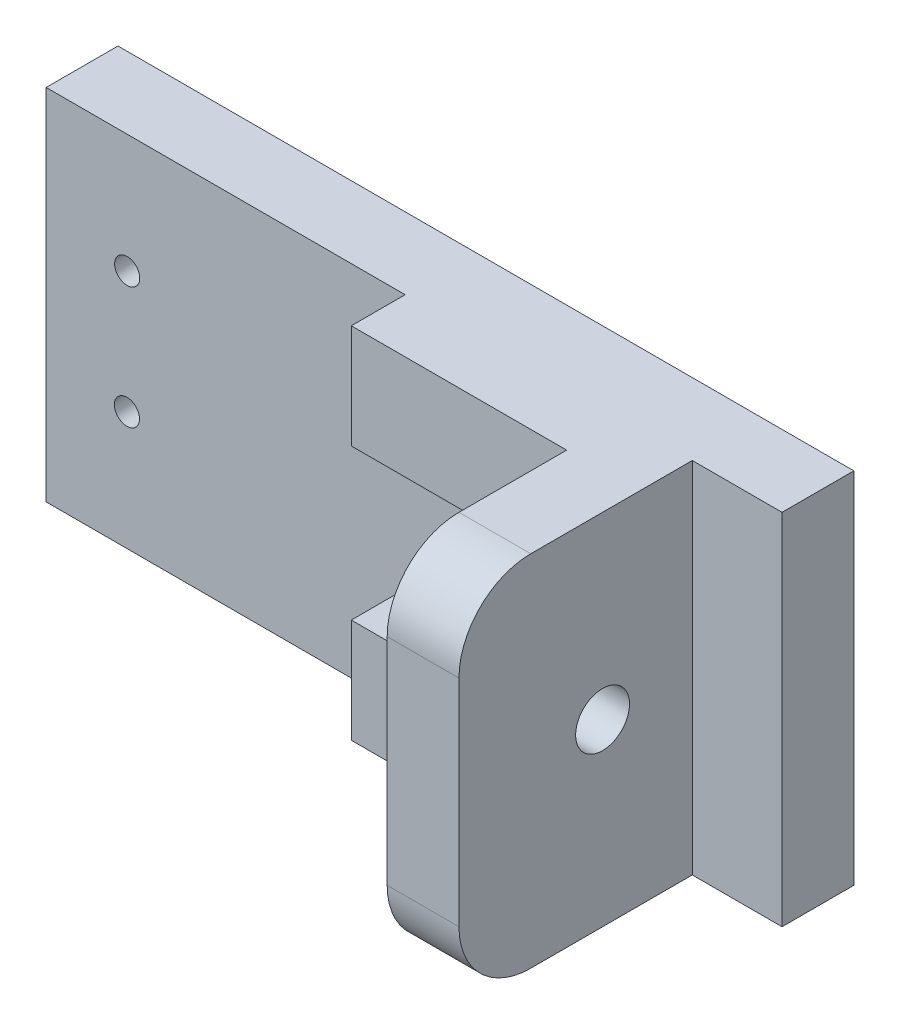
ISO-10303-21;
HEADER;
FILE_DESCRIPTION(('STEP AP214'),'2;1');
FILE_NAME('part.step','',(''),(''),'','','');
FILE_SCHEMA(('AUTOMOTIVE_DESIGN { 1 0 10303 214 1 1 1 1 }'));
ENDSEC;
DATA;
#1=APPLICATION_CONTEXT('core data for automotive mechanical design processes');
#2=APPLICATION_PROTOCOL_DEFINITION('international standard','automotive_design',2000,#1);
#3=PRODUCT_CONTEXT('',#1,'mechanical');
#4=PRODUCT('Part','Part','',(#3));
#5=PRODUCT_RELATED_PRODUCT_CATEGORY('part','',(#4));
#6=PRODUCT_DEFINITION_FORMATION('','',#4);
#7=PRODUCT_DEFINITION_CONTEXT('part definition',#1,'design');
#8=PRODUCT_DEFINITION('design','',#6,#7);
#9=PRODUCT_DEFINITION_SHAPE('','',#8);
#10=(LENGTH_UNIT() NAMED_UNIT(*) SI_UNIT(.MILLI.,.METRE.));
#11=(NAMED_UNIT(*) PLANE_ANGLE_UNIT() SI_UNIT($,.RADIAN.));
#12=(NAMED_UNIT(*) SI_UNIT($,.STERADIAN.) SOLID_ANGLE_UNIT());
#13=UNCERTAINTY_MEASURE_WITH_UNIT(LENGTH_MEASURE(1.E-05),#10,'distance_accuracy_value','');
#14=(GEOMETRIC_REPRESENTATION_CONTEXT(3) GLOBAL_UNCERTAINTY_ASSIGNED_CONTEXT((#13)) GLOBAL_UNIT_ASSIGNED_CONTEXT((#10,
#11,#12)) REPRESENTATION_CONTEXT('',''));
#15=CARTESIAN_POINT('',(0.,0.,0.));
#16=DIRECTION('',(0.,0.,1.));
#17=DIRECTION('',(1.,0.,0.));
#18=AXIS2_PLACEMENT_3D('',#15,#16,#17);
#19=CARTESIAN_POINT('',(0.,0.,20.));
#20=DIRECTION('',(0.,0.,-1.));
#21=DIRECTION('',(-1.,0.,0.));
#22=AXIS2_PLACEMENT_3D('',#19,#20,#21);
#23=PLANE('',#22);
#24=CARTESIAN_POINT('',(-80.,-17.,20.));
#25=DIRECTION('',(0.,0.,-1.));
#26=DIRECTION('',(-1.,0.,0.));
#27=AXIS2_PLACEMENT_3D('',#24,#25,#26);
#28=CIRCLE('',#27,3.49999999999999);
#29=CARTESIAN_POINT('',(-83.5,-17.,20.));
#30=VERTEX_POINT('',#29);
#31=EDGE_CURVE('E191',#30,#30,#28,.T.);
#32=ORIENTED_EDGE('',*,*,#31,.T.);
#33=EDGE_LOOP('',(#32));
#34=FACE_BOUND('',#33,.T.);
#35=CARTESIAN_POINT('',(-79.9316831395729,16.9999313647334,20.));
#36=DIRECTION('',(0.,0.,-1.));
#37=DIRECTION('',(-1.,0.,0.));
#38=AXIS2_PLACEMENT_3D('',#35,#36,#37);
#39=CIRCLE('',#38,3.49999999999999);
#40=CARTESIAN_POINT('',(-83.4316831395729,16.9999313647334,20.));
#41=VERTEX_POINT('',#40);
#42=EDGE_CURVE('E294',#41,#41,#39,.T.);
#43=ORIENTED_EDGE('',*,*,#42,.T.);
#44=EDGE_LOOP('',(#43));
#45=FACE_BOUND('',#44,.T.);
#46=DIRECTION('',(0.,-1.,0.));
#47=VECTOR('',#46,1.);
#48=CARTESIAN_POINT('',(57.5,-50.,20.));
#49=LINE('',#48,#47);
#50=CARTESIAN_POINT('',(57.5,21.,20.));
#51=VERTEX_POINT('',#50);
#52=CARTESIAN_POINT('',(57.5,-21.,20.));
#53=VERTEX_POINT('',#52);
#54=EDGE_CURVE('E175',#51,#53,#49,.T.);
#55=ORIENTED_EDGE('',*,*,#54,.F.);
#56=DIRECTION('',(1.,0.,0.));
#57=VECTOR('',#56,1.);
#58=CARTESIAN_POINT('',(57.5,21.,20.));
#59=LINE('',#58,#57);
#60=CARTESIAN_POINT('',(-2.50000000000002,21.,20.));
#61=VERTEX_POINT('',#60);
#62=EDGE_CURVE('E247',#61,#51,#59,.T.);
#63=ORIENTED_EDGE('',*,*,#62,.F.);
#64=DIRECTION('',(0.,-1.,0.));
#65=VECTOR('',#64,1.);
#66=CARTESIAN_POINT('',(-2.50000000000002,50.,20.));
#67=LINE('',#66,#65);
#68=CARTESIAN_POINT('',(-2.50000000000002,50.,20.));
#69=VERTEX_POINT('',#68);
#70=EDGE_CURVE('E244',#69,#61,#67,.T.);
#71=ORIENTED_EDGE('',*,*,#70,.F.);
#72=DIRECTION('',(-1.,0.,0.));
#73=VECTOR('',#72,1.);
#74=CARTESIAN_POINT('',(-102.5,50.,20.));
#75=LINE('',#74,#73);
#76=CARTESIAN_POINT('',(-102.5,50.,20.));
#77=VERTEX_POINT('',#76);
#78=EDGE_CURVE('E302',#69,#77,#75,.T.);
#79=ORIENTED_EDGE('',*,*,#78,.T.);
#80=DIRECTION('',(0.,-1.,0.));
#81=VECTOR('',#80,1.);
#82=CARTESIAN_POINT('',(-102.5,-50.,20.));
#83=LINE('',#82,#81);
#84=CARTESIAN_POINT('',(-102.5,-50.,20.));
#85=VERTEX_POINT('',#84);
#86=EDGE_CURVE('E182',#77,#85,#83,.T.);
#87=ORIENTED_EDGE('',*,*,#86,.T.);
#88=DIRECTION('',(1.,0.,0.));
#89=VECTOR('',#88,1.);
#90=CARTESIAN_POINT('',(-102.5,-50.,20.));
#91=LINE('',#90,#89);
#92=CARTESIAN_POINT('',(-2.50000000000004,-50.,20.));
#93=VERTEX_POINT('',#92);
#94=EDGE_CURVE('E181',#85,#93,#91,.T.);
#95=ORIENTED_EDGE('',*,*,#94,.T.);
#96=DIRECTION('',(0.,-1.,0.));
#97=VECTOR('',#96,1.);
#98=CARTESIAN_POINT('',(-2.50000000000002,-50.,20.));
#99=LINE('',#98,#97);
#100=CARTESIAN_POINT('',(-2.50000000000002,-21.,20.));
#101=VERTEX_POINT('',#100);
#102=EDGE_CURVE('E271',#101,#93,#99,.T.);
#103=ORIENTED_EDGE('',*,*,#102,.F.);
#104=DIRECTION('',(-1.,0.,0.));
#105=VECTOR('',#104,1.);
#106=CARTESIAN_POINT('',(57.5,-21.,20.));
#107=LINE('',#106,#105);
#108=EDGE_CURVE('E266',#53,#101,#107,.T.);
#109=ORIENTED_EDGE('',*,*,#108,.F.);
#110=EDGE_LOOP('',(#55,#63,#71,#79,#87,#95,#103,#109));
#111=FACE_BOUND('',#110,.T.);
#112=ADVANCED_FACE('F46',(#34,#45,#111),#23,.F.);
#113=DIRECTION('',(0.,1.,0.));
#114=VECTOR('',#113,1.);
#115=CARTESIAN_POINT('',(77.5,-50.,20.));
#116=LINE('',#115,#114);
#117=CARTESIAN_POINT('',(77.5,-50.,20.));
#118=VERTEX_POINT('',#117);
#119=CARTESIAN_POINT('',(77.5,50.,20.));
#120=VERTEX_POINT('',#119);
#121=EDGE_CURVE('E160',#118,#120,#116,.T.);
#122=ORIENTED_EDGE('',*,*,#121,.F.);
#123=CARTESIAN_POINT('',(102.5,-50.,20.));
#124=VERTEX_POINT('',#123);
#125=EDGE_CURVE('E171',#118,#124,#91,.T.);
#126=ORIENTED_EDGE('',*,*,#125,.T.);
#127=DIRECTION('',(0.,1.,0.));
#128=VECTOR('',#127,1.);
#129=CARTESIAN_POINT('',(102.5,-50.,20.));
#130=LINE('',#129,#128);
#131=CARTESIAN_POINT('',(102.5,50.,20.));
#132=VERTEX_POINT('',#131);
#133=EDGE_CURVE('E197',#124,#132,#130,.T.);
#134=ORIENTED_EDGE('',*,*,#133,.T.);
#135=EDGE_CURVE('E173',#132,#120,#75,.T.);
#136=ORIENTED_EDGE('',*,*,#135,.T.);
#137=EDGE_LOOP('',(#122,#126,#134,#136));
#138=FACE_BOUND('',#137,.T.);
#139=ADVANCED_FACE('F169',(#138),#23,.F.);
#140=CARTESIAN_POINT('',(102.5,-50.,20.));
#141=DIRECTION('',(-1.,0.,0.));
#142=DIRECTION('',(0.,0.,1.));
#143=AXIS2_PLACEMENT_3D('',#140,#141,#142);
#144=PLANE('',#143);
#145=DIRECTION('',(0.,1.,0.));
#146=VECTOR('',#145,1.);
#147=CARTESIAN_POINT('',(102.5,-50.,0.));
#148=LINE('',#147,#146);
#149=CARTESIAN_POINT('',(102.5,-50.,0.));
#150=VERTEX_POINT('',#149);
#151=CARTESIAN_POINT('',(102.5,50.,0.));
#152=VERTEX_POINT('',#151);
#153=EDGE_CURVE('E187',#150,#152,#148,.T.);
#154=ORIENTED_EDGE('',*,*,#153,.T.);
#155=DIRECTION('',(0.,0.,-1.));
#156=VECTOR('',#155,1.);
#157=CARTESIAN_POINT('',(102.5,50.,20.));
#158=LINE('',#157,#156);
#159=EDGE_CURVE('E205',#132,#152,#158,.T.);
#160=ORIENTED_EDGE('',*,*,#159,.F.);
#161=ORIENTED_EDGE('',*,*,#133,.F.);
#162=DIRECTION('',(0.,0.,-1.));
#163=VECTOR('',#162,1.);
#164=CARTESIAN_POINT('',(102.5,-50.,20.));
#165=LINE('',#164,#163);
#166=EDGE_CURVE('E179',#124,#150,#165,.T.);
#167=ORIENTED_EDGE('',*,*,#166,.T.);
#168=EDGE_LOOP('',(#154,#160,#161,#167));
#169=FACE_BOUND('',#168,.T.);
#170=ADVANCED_FACE('F350',(#169),#144,.F.);
#171=CARTESIAN_POINT('',(-102.5,50.,20.));
#172=DIRECTION('',(0.,-1.,0.));
#173=DIRECTION('',(0.,0.,-1.));
#174=AXIS2_PLACEMENT_3D('',#171,#172,#173);
#175=PLANE('',#174);
#176=DIRECTION('',(0.,0.,-1.));
#177=VECTOR('',#176,1.);
#178=CARTESIAN_POINT('',(57.5,50.,85.));
#179=LINE('',#178,#177);
#180=CARTESIAN_POINT('',(57.5,50.,65.));
#181=VERTEX_POINT('',#180);
#182=CARTESIAN_POINT('',(57.5,50.,35.));
#183=VERTEX_POINT('',#182);
#184=EDGE_CURVE('E229',#181,#183,#179,.T.);
#185=ORIENTED_EDGE('',*,*,#184,.F.);
#186=DIRECTION('',(-1.,0.,0.));
#187=VECTOR('',#186,1.);
#188=CARTESIAN_POINT('',(-102.5,50.,65.));
#189=LINE('',#188,#187);
#190=CARTESIAN_POINT('',(77.5,50.,65.));
#191=VERTEX_POINT('',#190);
#192=EDGE_CURVE('E69',#181,#191,#189,.F.);
#193=ORIENTED_EDGE('',*,*,#192,.T.);
#194=DIRECTION('',(0.,0.,-1.));
#195=VECTOR('',#194,1.);
#196=CARTESIAN_POINT('',(77.5,50.,85.));
#197=LINE('',#196,#195);
#198=EDGE_CURVE('E166',#191,#120,#197,.T.);
#199=ORIENTED_EDGE('',*,*,#198,.T.);
#200=ORIENTED_EDGE('',*,*,#135,.F.);
#201=ORIENTED_EDGE('',*,*,#159,.T.);
#202=DIRECTION('',(-1.,0.,0.));
#203=VECTOR('',#202,1.);
#204=CARTESIAN_POINT('',(-102.5,50.,0.));
#205=LINE('',#204,#203);
#206=CARTESIAN_POINT('',(-102.5,50.,0.));
#207=VERTEX_POINT('',#206);
#208=EDGE_CURVE('E190',#152,#207,#205,.T.);
#209=ORIENTED_EDGE('',*,*,#208,.T.);
#210=DIRECTION('',(0.,0.,-1.));
#211=VECTOR('',#210,1.);
#212=CARTESIAN_POINT('',(-102.5,50.,20.));
#213=LINE('',#212,#211);
#214=EDGE_CURVE('E202',#77,#207,#213,.T.);
#215=ORIENTED_EDGE('',*,*,#214,.F.);
#216=ORIENTED_EDGE('',*,*,#78,.F.);
#217=DIRECTION('',(0.,0.,-1.));
#218=VECTOR('',#217,1.);
#219=CARTESIAN_POINT('',(-2.50000000000002,50.,35.));
#220=LINE('',#219,#218);
#221=CARTESIAN_POINT('',(-2.50000000000002,50.,35.));
#222=VERTEX_POINT('',#221);
#223=EDGE_CURVE('E263',#222,#69,#220,.T.);
#224=ORIENTED_EDGE('',*,*,#223,.F.);
#225=DIRECTION('',(-1.,0.,0.));
#226=VECTOR('',#225,1.);
#227=CARTESIAN_POINT('',(57.5,50.,35.));
#228=LINE('',#227,#226);
#229=EDGE_CURVE('E237',#183,#222,#228,.T.);
#230=ORIENTED_EDGE('',*,*,#229,.F.);
#231=EDGE_LOOP('',(#185,#193,#199,#200,#201,#209,#215,#216,#224,#230));
#232=FACE_BOUND('',#231,.T.);
#233=ADVANCED_FACE('F235',(#232),#175,.F.);
#234=CARTESIAN_POINT('',(-102.5,-50.,20.));
#235=DIRECTION('',(1.,0.,0.));
#236=DIRECTION('',(0.,0.,-1.));
#237=AXIS2_PLACEMENT_3D('',#234,#235,#236);
#238=PLANE('',#237);
#239=DIRECTION('',(0.,-1.,0.));
#240=VECTOR('',#239,1.);
#241=CARTESIAN_POINT('',(-102.5,-50.,0.));
#242=LINE('',#241,#240);
#243=CARTESIAN_POINT('',(-102.5,-50.,0.));
#244=VERTEX_POINT('',#243);
#245=EDGE_CURVE('E193',#207,#244,#242,.T.);
#246=ORIENTED_EDGE('',*,*,#245,.T.);
#247=DIRECTION('',(0.,0.,-1.));
#248=VECTOR('',#247,1.);
#249=CARTESIAN_POINT('',(-102.5,-50.,20.));
#250=LINE('',#249,#248);
#251=EDGE_CURVE('E199',#85,#244,#250,.T.);
#252=ORIENTED_EDGE('',*,*,#251,.F.);
#253=ORIENTED_EDGE('',*,*,#86,.F.);
#254=ORIENTED_EDGE('',*,*,#214,.T.);
#255=EDGE_LOOP('',(#246,#252,#253,#254));
#256=FACE_BOUND('',#255,.T.);
#257=ADVANCED_FACE('F311',(#256),#238,.F.);
#258=CARTESIAN_POINT('',(-102.5,-50.,20.));
#259=DIRECTION('',(0.,1.,0.));
#260=DIRECTION('',(0.,0.,1.));
#261=AXIS2_PLACEMENT_3D('',#258,#259,#260);
#262=PLANE('',#261);
#263=DIRECTION('',(0.,0.,-1.));
#264=VECTOR('',#263,1.);
#265=CARTESIAN_POINT('',(77.5,-50.,85.));
#266=LINE('',#265,#264);
#267=CARTESIAN_POINT('',(77.5,-50.,65.));
#268=VERTEX_POINT('',#267);
#269=EDGE_CURVE('E157',#268,#118,#266,.T.);
#270=ORIENTED_EDGE('',*,*,#269,.F.);
#271=DIRECTION('',(1.,0.,0.));
#272=VECTOR('',#271,1.);
#273=CARTESIAN_POINT('',(-102.5,-50.,65.));
#274=LINE('',#273,#272);
#275=CARTESIAN_POINT('',(57.5,-50.,65.));
#276=VERTEX_POINT('',#275);
#277=EDGE_CURVE('E11',#268,#276,#274,.F.);
#278=ORIENTED_EDGE('',*,*,#277,.T.);
#279=DIRECTION('',(0.,0.,-1.));
#280=VECTOR('',#279,1.);
#281=CARTESIAN_POINT('',(57.5,-50.,85.));
#282=LINE('',#281,#280);
#283=CARTESIAN_POINT('',(57.5,-50.,35.));
#284=VERTEX_POINT('',#283);
#285=EDGE_CURVE('E165',#276,#284,#282,.T.);
#286=ORIENTED_EDGE('',*,*,#285,.T.);
#287=DIRECTION('',(1.,0.,0.));
#288=VECTOR('',#287,1.);
#289=CARTESIAN_POINT('',(57.5,-50.,35.));
#290=LINE('',#289,#288);
#291=CARTESIAN_POINT('',(-2.50000000000002,-50.,35.));
#292=VERTEX_POINT('',#291);
#293=EDGE_CURVE('E275',#292,#284,#290,.T.);
#294=ORIENTED_EDGE('',*,*,#293,.F.);
#295=DIRECTION('',(0.,0.,-1.));
#296=VECTOR('',#295,1.);
#297=CARTESIAN_POINT('',(-2.50000000000002,-50.,35.));
#298=LINE('',#297,#296);
#299=EDGE_CURVE('E278',#292,#93,#298,.T.);
#300=ORIENTED_EDGE('',*,*,#299,.T.);
#301=ORIENTED_EDGE('',*,*,#94,.F.);
#302=ORIENTED_EDGE('',*,*,#251,.T.);
#303=DIRECTION('',(1.,0.,0.));
#304=VECTOR('',#303,1.);
#305=CARTESIAN_POINT('',(-102.5,-50.,0.));
#306=LINE('',#305,#304);
#307=EDGE_CURVE('E195',#244,#150,#306,.T.);
#308=ORIENTED_EDGE('',*,*,#307,.T.);
#309=ORIENTED_EDGE('',*,*,#166,.F.);
#310=ORIENTED_EDGE('',*,*,#125,.F.);
#311=EDGE_LOOP('',(#270,#278,#286,#294,#300,#301,#302,#308,#309,#310));
#312=FACE_BOUND('',#311,.T.);
#313=ADVANCED_FACE('F177',(#312),#262,.F.);
#314=CARTESIAN_POINT('',(0.,0.,0.));
#315=DIRECTION('',(0.,0.,-1.));
#316=DIRECTION('',(-1.,0.,0.));
#317=AXIS2_PLACEMENT_3D('',#314,#315,#316);
#318=PLANE('',#317);
#319=CARTESIAN_POINT('',(-79.9316831395729,16.9999313647334,0.));
#320=DIRECTION('',(0.,0.,-1.));
#321=DIRECTION('',(-1.,0.,0.));
#322=AXIS2_PLACEMENT_3D('',#319,#320,#321);
#323=CIRCLE('',#322,3.49999999999999);
#324=CARTESIAN_POINT('',(-83.4316831395729,16.9999313647334,0.));
#325=VERTEX_POINT('',#324);
#326=EDGE_CURVE('E291',#325,#325,#323,.T.);
#327=ORIENTED_EDGE('',*,*,#326,.F.);
#328=EDGE_LOOP('',(#327));
#329=FACE_BOUND('',#328,.T.);
#330=CARTESIAN_POINT('',(-80.,-17.,0.));
#331=DIRECTION('',(0.,0.,-1.));
#332=DIRECTION('',(-1.,0.,0.));
#333=AXIS2_PLACEMENT_3D('',#330,#331,#332);
#334=CIRCLE('',#333,3.49999999999999);
#335=CARTESIAN_POINT('',(-83.5,-17.,0.));
#336=VERTEX_POINT('',#335);
#337=EDGE_CURVE('E297',#336,#336,#334,.T.);
#338=ORIENTED_EDGE('',*,*,#337,.F.);
#339=EDGE_LOOP('',(#338));
#340=FACE_BOUND('',#339,.T.);
#341=ORIENTED_EDGE('',*,*,#153,.F.);
#342=ORIENTED_EDGE('',*,*,#307,.F.);
#343=ORIENTED_EDGE('',*,*,#245,.F.);
#344=ORIENTED_EDGE('',*,*,#208,.F.);
#345=EDGE_LOOP('',(#341,#342,#343,#344));
#346=FACE_BOUND('',#345,.T.);
#347=ADVANCED_FACE('F356',(#329,#340,#346),#318,.T.);
#348=CARTESIAN_POINT('',(-80.,-17.,0.));
#349=DIRECTION('',(0.,0.,-1.));
#350=DIRECTION('',(-1.,0.,0.));
#351=AXIS2_PLACEMENT_3D('',#348,#349,#350);
#352=CYLINDRICAL_SURFACE('',#351,3.49999999999999);
#353=ORIENTED_EDGE('',*,*,#31,.F.);
#354=EDGE_LOOP('',(#353));
#355=FACE_BOUND('',#354,.T.);
#356=ORIENTED_EDGE('',*,*,#337,.T.);
#357=EDGE_LOOP('',(#356));
#358=FACE_BOUND('',#357,.T.);
#359=ADVANCED_FACE('F354',(#355,#358),#352,.F.);
#360=CARTESIAN_POINT('',(-79.9316831395729,16.9999313647334,0.));
#361=DIRECTION('',(0.,0.,-1.));
#362=DIRECTION('',(-1.,0.,0.));
#363=AXIS2_PLACEMENT_3D('',#360,#361,#362);
#364=CYLINDRICAL_SURFACE('',#363,3.49999999999999);
#365=ORIENTED_EDGE('',*,*,#42,.F.);
#366=EDGE_LOOP('',(#365));
#367=FACE_BOUND('',#366,.T.);
#368=ORIENTED_EDGE('',*,*,#326,.T.);
#369=EDGE_LOOP('',(#368));
#370=FACE_BOUND('',#369,.T.);
#371=ADVANCED_FACE('F409',(#367,#370),#364,.F.);
#372=CARTESIAN_POINT('',(57.5,-21.,35.));
#373=DIRECTION('',(0.,-1.,0.));
#374=DIRECTION('',(1.,0.,0.));
#375=AXIS2_PLACEMENT_3D('',#372,#373,#374);
#376=PLANE('',#375);
#377=ORIENTED_EDGE('',*,*,#108,.T.);
#378=DIRECTION('',(0.,0.,-1.));
#379=VECTOR('',#378,1.);
#380=CARTESIAN_POINT('',(-2.50000000000002,-21.,35.));
#381=LINE('',#380,#379);
#382=CARTESIAN_POINT('',(-2.50000000000002,-21.,35.));
#383=VERTEX_POINT('',#382);
#384=EDGE_CURVE('E285',#383,#101,#381,.T.);
#385=ORIENTED_EDGE('',*,*,#384,.F.);
#386=DIRECTION('',(-1.,0.,0.));
#387=VECTOR('',#386,1.);
#388=CARTESIAN_POINT('',(57.5,-21.,35.));
#389=LINE('',#388,#387);
#390=CARTESIAN_POINT('',(57.5,-21.,35.));
#391=VERTEX_POINT('',#390);
#392=EDGE_CURVE('E270',#391,#383,#389,.T.);
#393=ORIENTED_EDGE('',*,*,#392,.F.);
#394=DIRECTION('',(0.,0.,-1.));
#395=VECTOR('',#394,1.);
#396=CARTESIAN_POINT('',(57.5,-21.,35.));
#397=LINE('',#396,#395);
#398=EDGE_CURVE('E288',#391,#53,#397,.T.);
#399=ORIENTED_EDGE('',*,*,#398,.T.);
#400=EDGE_LOOP('',(#377,#385,#393,#399));
#401=FACE_BOUND('',#400,.T.);
#402=ADVANCED_FACE('F323',(#401),#376,.F.);
#403=CARTESIAN_POINT('',(-2.50000000000002,-50.,35.));
#404=DIRECTION('',(1.,0.,0.));
#405=DIRECTION('',(0.,0.,-1.));
#406=AXIS2_PLACEMENT_3D('',#403,#404,#405);
#407=PLANE('',#406);
#408=ORIENTED_EDGE('',*,*,#102,.T.);
#409=ORIENTED_EDGE('',*,*,#299,.F.);
#410=DIRECTION('',(0.,-1.,0.));
#411=VECTOR('',#410,1.);
#412=CARTESIAN_POINT('',(-2.50000000000002,-50.,35.));
#413=LINE('',#412,#411);
#414=EDGE_CURVE('E273',#383,#292,#413,.T.);
#415=ORIENTED_EDGE('',*,*,#414,.F.);
#416=ORIENTED_EDGE('',*,*,#384,.T.);
#417=EDGE_LOOP('',(#408,#409,#415,#416));
#418=FACE_BOUND('',#417,.T.);
#419=ADVANCED_FACE('F318',(#418),#407,.F.);
#420=CARTESIAN_POINT('',(0.,0.,35.));
#421=DIRECTION('',(0.,0.,1.));
#422=DIRECTION('',(1.,0.,0.));
#423=AXIS2_PLACEMENT_3D('',#420,#421,#422);
#424=PLANE('',#423);
#425=DIRECTION('',(0.,1.,0.));
#426=VECTOR('',#425,1.);
#427=CARTESIAN_POINT('',(57.5,-50.,35.));
#428=LINE('',#427,#426);
#429=EDGE_CURVE('E267',#284,#391,#428,.T.);
#430=ORIENTED_EDGE('',*,*,#429,.T.);
#431=ORIENTED_EDGE('',*,*,#392,.T.);
#432=ORIENTED_EDGE('',*,*,#414,.T.);
#433=ORIENTED_EDGE('',*,*,#293,.T.);
#434=EDGE_LOOP('',(#430,#431,#432,#433));
#435=FACE_BOUND('',#434,.T.);
#436=ADVANCED_FACE('F398',(#435),#424,.T.);
#437=CARTESIAN_POINT('',(-2.50000000000002,50.,35.));
#438=DIRECTION('',(1.,0.,0.));
#439=DIRECTION('',(0.,0.,-1.));
#440=AXIS2_PLACEMENT_3D('',#437,#438,#439);
#441=PLANE('',#440);
#442=ORIENTED_EDGE('',*,*,#70,.T.);
#443=DIRECTION('',(0.,0.,-1.));
#444=VECTOR('',#443,1.);
#445=CARTESIAN_POINT('',(-2.50000000000002,21.,35.));
#446=LINE('',#445,#444);
#447=CARTESIAN_POINT('',(-2.50000000000002,21.,35.));
#448=VERTEX_POINT('',#447);
#449=EDGE_CURVE('E260',#448,#61,#446,.T.);
#450=ORIENTED_EDGE('',*,*,#449,.F.);
#451=DIRECTION('',(0.,-1.,0.));
#452=VECTOR('',#451,1.);
#453=CARTESIAN_POINT('',(-2.50000000000002,50.,35.));
#454=LINE('',#453,#452);
#455=EDGE_CURVE('E249',#222,#448,#454,.T.);
#456=ORIENTED_EDGE('',*,*,#455,.F.);
#457=ORIENTED_EDGE('',*,*,#223,.T.);
#458=EDGE_LOOP('',(#442,#450,#456,#457));
#459=FACE_BOUND('',#458,.T.);
#460=ADVANCED_FACE('F332',(#459),#441,.F.);
#461=CARTESIAN_POINT('',(57.5,21.,35.));
#462=DIRECTION('',(0.,1.,0.));
#463=DIRECTION('',(-1.,0.,0.));
#464=AXIS2_PLACEMENT_3D('',#461,#462,#463);
#465=PLANE('',#464);
#466=ORIENTED_EDGE('',*,*,#62,.T.);
#467=DIRECTION('',(0.,0.,-1.));
#468=VECTOR('',#467,1.);
#469=CARTESIAN_POINT('',(57.5,21.,35.));
#470=LINE('',#469,#468);
#471=CARTESIAN_POINT('',(57.5,21.,35.));
#472=VERTEX_POINT('',#471);
#473=EDGE_CURVE('E254',#472,#51,#470,.T.);
#474=ORIENTED_EDGE('',*,*,#473,.F.);
#475=DIRECTION('',(1.,0.,0.));
#476=VECTOR('',#475,1.);
#477=CARTESIAN_POINT('',(57.5,21.,35.));
#478=LINE('',#477,#476);
#479=EDGE_CURVE('E251',#448,#472,#478,.T.);
#480=ORIENTED_EDGE('',*,*,#479,.F.);
#481=ORIENTED_EDGE('',*,*,#449,.T.);
#482=EDGE_LOOP('',(#466,#474,#480,#481));
#483=FACE_BOUND('',#482,.T.);
#484=ADVANCED_FACE('F327',(#483),#465,.F.);
#485=CARTESIAN_POINT('',(0.,0.,35.));
#486=DIRECTION('',(0.,0.,-1.));
#487=DIRECTION('',(-1.,0.,0.));
#488=AXIS2_PLACEMENT_3D('',#485,#486,#487);
#489=PLANE('',#488);
#490=DIRECTION('',(0.,1.,0.));
#491=VECTOR('',#490,1.);
#492=CARTESIAN_POINT('',(57.5,50.,35.));
#493=LINE('',#492,#491);
#494=EDGE_CURVE('E245',#472,#183,#493,.T.);
#495=ORIENTED_EDGE('',*,*,#494,.T.);
#496=ORIENTED_EDGE('',*,*,#229,.T.);
#497=ORIENTED_EDGE('',*,*,#455,.T.);
#498=ORIENTED_EDGE('',*,*,#479,.T.);
#499=EDGE_LOOP('',(#495,#496,#497,#498));
#500=FACE_BOUND('',#499,.T.);
#501=ADVANCED_FACE('F334',(#500),#489,.F.);
#502=CARTESIAN_POINT('',(57.5,-50.,85.));
#503=DIRECTION('',(1.,0.,0.));
#504=DIRECTION('',(0.,0.,-1.));
#505=AXIS2_PLACEMENT_3D('',#502,#503,#504);
#506=PLANE('',#505);
#507=CARTESIAN_POINT('',(57.5,0.,45.));
#508=DIRECTION('',(1.,0.,0.));
#509=DIRECTION('',(0.,0.,-1.));
#510=AXIS2_PLACEMENT_3D('',#507,#508,#509);
#511=CIRCLE('',#510,7.5);
#512=CARTESIAN_POINT('',(57.4999999999999,0.,37.5));
#513=VERTEX_POINT('',#512);
#514=EDGE_CURVE('E324',#513,#513,#511,.T.);
#515=ORIENTED_EDGE('',*,*,#514,.T.);
#516=EDGE_LOOP('',(#515));
#517=FACE_BOUND('',#516,.T.);
#518=DIRECTION('',(0.,-1.,0.));
#519=VECTOR('',#518,1.);
#520=CARTESIAN_POINT('',(57.5,-50.,85.));
#521=LINE('',#520,#519);
#522=CARTESIAN_POINT('',(57.5,30.,85.));
#523=VERTEX_POINT('',#522);
#524=CARTESIAN_POINT('',(57.5,-30.,85.));
#525=VERTEX_POINT('',#524);
#526=EDGE_CURVE('E174',#523,#525,#521,.T.);
#527=ORIENTED_EDGE('',*,*,#526,.F.);
#528=CARTESIAN_POINT('',(57.5,30.,65.));
#529=DIRECTION('',(1.,0.,0.));
#530=DIRECTION('',(0.,0.,-1.));
#531=AXIS2_PLACEMENT_3D('',#528,#529,#530);
#532=CIRCLE('',#531,20.);
#533=EDGE_CURVE('E216',#523,#181,#532,.F.);
#534=ORIENTED_EDGE('',*,*,#533,.T.);
#535=ORIENTED_EDGE('',*,*,#184,.T.);
#536=ORIENTED_EDGE('',*,*,#494,.F.);
#537=ORIENTED_EDGE('',*,*,#473,.T.);
#538=ORIENTED_EDGE('',*,*,#54,.T.);
#539=ORIENTED_EDGE('',*,*,#398,.F.);
#540=ORIENTED_EDGE('',*,*,#429,.F.);
#541=ORIENTED_EDGE('',*,*,#285,.F.);
#542=CARTESIAN_POINT('',(57.5,-30.,65.));
#543=DIRECTION('',(1.,0.,0.));
#544=DIRECTION('',(0.,0.,-1.));
#545=AXIS2_PLACEMENT_3D('',#542,#543,#544);
#546=CIRCLE('',#545,20.);
#547=EDGE_CURVE('E214',#276,#525,#546,.F.);
#548=ORIENTED_EDGE('',*,*,#547,.T.);
#549=EDGE_LOOP('',(#527,#534,#535,#536,#537,#538,#539,#540,#541,#548));
#550=FACE_BOUND('',#549,.T.);
#551=ADVANCED_FACE('F233',(#517,#550),#506,.F.);
#552=CARTESIAN_POINT('',(77.5,-50.,85.));
#553=DIRECTION('',(-1.,0.,0.));
#554=DIRECTION('',(0.,0.,1.));
#555=AXIS2_PLACEMENT_3D('',#552,#553,#554);
#556=PLANE('',#555);
#557=CARTESIAN_POINT('',(77.5,0.,45.));
#558=DIRECTION('',(1.,0.,0.));
#559=DIRECTION('',(0.,0.,-1.));
#560=AXIS2_PLACEMENT_3D('',#557,#558,#559);
#561=CIRCLE('',#560,7.5);
#562=CARTESIAN_POINT('',(77.5,0.,37.5));
#563=VERTEX_POINT('',#562);
#564=EDGE_CURVE('E389',#563,#563,#561,.T.);
#565=ORIENTED_EDGE('',*,*,#564,.F.);
#566=EDGE_LOOP('',(#565));
#567=FACE_BOUND('',#566,.T.);
#568=ORIENTED_EDGE('',*,*,#198,.F.);
#569=CARTESIAN_POINT('',(77.5,30.,65.));
#570=DIRECTION('',(-1.,0.,0.));
#571=DIRECTION('',(0.,0.,1.));
#572=AXIS2_PLACEMENT_3D('',#569,#570,#571);
#573=CIRCLE('',#572,20.);
#574=CARTESIAN_POINT('',(77.5,30.,85.));
#575=VERTEX_POINT('',#574);
#576=EDGE_CURVE('E54',#191,#575,#573,.F.);
#577=ORIENTED_EDGE('',*,*,#576,.T.);
#578=DIRECTION('',(0.,1.,0.));
#579=VECTOR('',#578,1.);
#580=CARTESIAN_POINT('',(77.5,-50.,85.));
#581=LINE('',#580,#579);
#582=CARTESIAN_POINT('',(77.5,-30.,85.));
#583=VERTEX_POINT('',#582);
#584=EDGE_CURVE('E221',#583,#575,#581,.T.);
#585=ORIENTED_EDGE('',*,*,#584,.F.);
#586=CARTESIAN_POINT('',(77.5,-30.,65.));
#587=DIRECTION('',(-1.,0.,0.));
#588=DIRECTION('',(0.,0.,1.));
#589=AXIS2_PLACEMENT_3D('',#586,#587,#588);
#590=CIRCLE('',#589,20.);
#591=EDGE_CURVE('E61',#583,#268,#590,.F.);
#592=ORIENTED_EDGE('',*,*,#591,.T.);
#593=ORIENTED_EDGE('',*,*,#269,.T.);
#594=ORIENTED_EDGE('',*,*,#121,.T.);
#595=EDGE_LOOP('',(#568,#577,#585,#592,#593,#594));
#596=FACE_BOUND('',#595,.T.);
#597=ADVANCED_FACE('F159',(#567,#596),#556,.F.);
#598=CARTESIAN_POINT('',(0.,0.,85.));
#599=DIRECTION('',(0.,0.,-1.));
#600=DIRECTION('',(-1.,0.,0.));
#601=AXIS2_PLACEMENT_3D('',#598,#599,#600);
#602=PLANE('',#601);
#603=ORIENTED_EDGE('',*,*,#584,.T.);
#604=DIRECTION('',(-1.,0.,0.));
#605=VECTOR('',#604,1.);
#606=CARTESIAN_POINT('',(0.,30.,85.));
#607=LINE('',#606,#605);
#608=EDGE_CURVE('E211',#575,#523,#607,.T.);
#609=ORIENTED_EDGE('',*,*,#608,.T.);
#610=ORIENTED_EDGE('',*,*,#526,.T.);
#611=DIRECTION('',(1.,0.,0.));
#612=VECTOR('',#611,1.);
#613=CARTESIAN_POINT('',(0.,-30.,85.));
#614=LINE('',#613,#612);
#615=EDGE_CURVE('E208',#525,#583,#614,.T.);
#616=ORIENTED_EDGE('',*,*,#615,.T.);
#617=EDGE_LOOP('',(#603,#609,#610,#616));
#618=FACE_BOUND('',#617,.T.);
#619=ADVANCED_FACE('F225',(#618),#602,.F.);
#620=CARTESIAN_POINT('',(-102.5,0.,45.));
#621=DIRECTION('',(1.,0.,0.));
#622=DIRECTION('',(0.,0.,-1.));
#623=AXIS2_PLACEMENT_3D('',#620,#621,#622);
#624=CYLINDRICAL_SURFACE('',#623,7.5);
#625=CARTESIAN_POINT('',(77.5,0.,37.5));
#626=CARTESIAN_POINT('',(77.2916666666666,0.,37.5));
#627=CARTESIAN_POINT('',(77.0833333333333,0.,37.5));
#628=CARTESIAN_POINT('',(76.6666666666666,0.,37.5));
#629=CARTESIAN_POINT('',(76.4583333333333,0.,37.5));
#630=CARTESIAN_POINT('',(76.0416666666666,0.,37.5));
#631=CARTESIAN_POINT('',(75.8333333333333,0.,37.5));
#632=CARTESIAN_POINT('',(75.4166666666666,0.,37.5));
#633=CARTESIAN_POINT('',(75.2083333333333,0.,37.5));
#634=CARTESIAN_POINT('',(74.7916666666666,0.,37.5));
#635=CARTESIAN_POINT('',(74.5833333333333,0.,37.5));
#636=CARTESIAN_POINT('',(74.1666666666666,0.,37.5));
#637=CARTESIAN_POINT('',(73.9583333333333,0.,37.5));
#638=CARTESIAN_POINT('',(73.5416666666666,0.,37.5));
#639=CARTESIAN_POINT('',(73.3333333333333,0.,37.5));
#640=CARTESIAN_POINT('',(72.9166666666666,0.,37.5));
#641=CARTESIAN_POINT('',(72.7083333333333,0.,37.5));
#642=CARTESIAN_POINT('',(72.2916666666666,0.,37.5));
#643=CARTESIAN_POINT('',(72.0833333333333,0.,37.5));
#644=CARTESIAN_POINT('',(71.6666666666666,0.,37.5));
#645=CARTESIAN_POINT('',(71.4583333333333,0.,37.5));
#646=CARTESIAN_POINT('',(71.0416666666666,0.,37.5));
#647=CARTESIAN_POINT('',(70.8333333333333,0.,37.5));
#648=CARTESIAN_POINT('',(70.4166666666666,0.,37.5));
#649=CARTESIAN_POINT('',(70.2083333333333,0.,37.5));
#650=CARTESIAN_POINT('',(69.7916666666666,0.,37.5));
#651=CARTESIAN_POINT('',(69.5833333333333,0.,37.5));
#652=CARTESIAN_POINT('',(69.1666666666666,0.,37.5));
#653=CARTESIAN_POINT('',(68.9583333333333,0.,37.5));
#654=CARTESIAN_POINT('',(68.5416666666666,0.,37.5));
#655=CARTESIAN_POINT('',(68.3333333333333,0.,37.5));
#656=CARTESIAN_POINT('',(67.9166666666666,0.,37.5));
#657=CARTESIAN_POINT('',(67.7083333333333,0.,37.5));
#658=CARTESIAN_POINT('',(67.2916666666666,0.,37.5));
#659=CARTESIAN_POINT('',(67.0833333333333,0.,37.5));
#660=CARTESIAN_POINT('',(66.6666666666666,0.,37.5));
#661=CARTESIAN_POINT('',(66.4583333333333,0.,37.5));
#662=CARTESIAN_POINT('',(66.0416666666666,0.,37.5));
#663=CARTESIAN_POINT('',(65.8333333333333,0.,37.5));
#664=CARTESIAN_POINT('',(65.4166666666666,0.,37.5));
#665=CARTESIAN_POINT('',(65.2083333333333,0.,37.5));
#666=CARTESIAN_POINT('',(64.7916666666666,0.,37.5));
#667=CARTESIAN_POINT('',(64.5833333333333,0.,37.5));
#668=CARTESIAN_POINT('',(64.1666666666666,0.,37.5));
#669=CARTESIAN_POINT('',(63.9583333333333,0.,37.5));
#670=CARTESIAN_POINT('',(63.5416666666666,0.,37.5));
#671=CARTESIAN_POINT('',(63.3333333333333,0.,37.5));
#672=CARTESIAN_POINT('',(62.9166666666666,0.,37.5));
#673=CARTESIAN_POINT('',(62.7083333333333,0.,37.5));
#674=CARTESIAN_POINT('',(62.2916666666666,0.,37.5));
#675=CARTESIAN_POINT('',(62.0833333333333,0.,37.5));
#676=CARTESIAN_POINT('',(61.6666666666666,0.,37.5));
#677=CARTESIAN_POINT('',(61.4583333333333,0.,37.5));
#678=CARTESIAN_POINT('',(61.0416666666666,0.,37.5));
#679=CARTESIAN_POINT('',(60.8333333333333,0.,37.5));
#680=CARTESIAN_POINT('',(60.4166666666666,0.,37.5));
#681=CARTESIAN_POINT('',(60.2083333333333,0.,37.5));
#682=CARTESIAN_POINT('',(59.7916666666666,0.,37.5));
#683=CARTESIAN_POINT('',(59.5833333333333,0.,37.5));
#684=CARTESIAN_POINT('',(59.1666666666666,0.,37.5));
#685=CARTESIAN_POINT('',(58.9583333333333,0.,37.5));
#686=CARTESIAN_POINT('',(58.5416666666666,0.,37.5));
#687=CARTESIAN_POINT('',(58.3333333333333,0.,37.5));
#688=CARTESIAN_POINT('',(57.9166666666666,0.,37.5));
#689=CARTESIAN_POINT('',(57.7083333333333,0.,37.5));
#690=CARTESIAN_POINT('',(57.4999999999999,0.,37.5));
#691=B_SPLINE_CURVE_WITH_KNOTS('',3,(#625,#626,#627,#628,#629,#630,#631,#632,#633,#634,#635,
#636,#637,#638,#639,#640,#641,#642,#643,#644,#645,#646,#647,#648,#649,#650,#651,#652,#653,#654,
#655,#656,#657,#658,#659,#660,#661,#662,#663,#664,#665,#666,#667,#668,#669,#670,#671,#672,#673,
#674,#675,#676,#677,#678,#679,#680,#681,#682,#683,#684,#685,#686,#687,#688,#689,#690),
.UNSPECIFIED.,.F.,.F.,(4,2,2,2,2,2,2,2,2,2,2,2,2,2,2,2,2,2,2,2,2,2,2,2,2,2,2,2,2,2,2,2,4),(0.,
0.624999999999987,1.25,1.87500000000002,2.5,3.12499999999999,3.75,4.37500000000002,5.,
5.62499999999999,6.25000000000001,6.87500000000002,7.50000000000001,8.12499999999999,
8.75000000000001,9.37500000000002,10.,10.625,11.25,11.875,12.5,13.125,13.75,14.375,15.,15.625,
16.25,16.875,17.5,18.125,18.75,19.375,20.),.UNSPECIFIED.);
#692=EDGE_CURVE('BSEAM369',#563,#513,#691,.T.);
#693=ORIENTED_EDGE('',*,*,#564,.T.);
#694=ORIENTED_EDGE('',*,*,#514,.F.);
#695=ORIENTED_EDGE('',*,*,#692,.T.);
#696=ORIENTED_EDGE('',*,*,#692,.F.);
#697=EDGE_LOOP('',(#693,#695,#694,#696));
#698=FACE_BOUND('',#697,.T.);
#699=ADVANCED_FACE('F369',(#698),#624,.F.);
#700=CARTESIAN_POINT('',(0.,30.,65.));
#701=DIRECTION('',(-1.,0.,0.));
#702=DIRECTION('',(0.,0.,1.));
#703=AXIS2_PLACEMENT_3D('',#700,#701,#702);
#704=CYLINDRICAL_SURFACE('',#703,20.);
#705=ORIENTED_EDGE('',*,*,#576,.F.);
#706=ORIENTED_EDGE('',*,*,#192,.F.);
#707=ORIENTED_EDGE('',*,*,#533,.F.);
#708=ORIENTED_EDGE('',*,*,#608,.F.);
#709=EDGE_LOOP('',(#705,#706,#707,#708));
#710=FACE_BOUND('',#709,.T.);
#711=ADVANCED_FACE('F231',(#710),#704,.T.);
#712=CARTESIAN_POINT('',(0.,-30.,65.));
#713=DIRECTION('',(1.,0.,0.));
#714=DIRECTION('',(0.,0.,-1.));
#715=AXIS2_PLACEMENT_3D('',#712,#713,#714);
#716=CYLINDRICAL_SURFACE('',#715,20.);
#717=ORIENTED_EDGE('',*,*,#547,.F.);
#718=ORIENTED_EDGE('',*,*,#277,.F.);
#719=ORIENTED_EDGE('',*,*,#591,.F.);
#720=ORIENTED_EDGE('',*,*,#615,.F.);
#721=EDGE_LOOP('',(#717,#718,#719,#720));
#722=FACE_BOUND('',#721,.T.);
#723=ADVANCED_FACE('F48',(#722),#716,.T.);
#724=CLOSED_SHELL('',(#112,#139,#170,#233,#257,#313,#347,#359,#371,#402,#419,#436,#460,#484,
#501,#551,#597,#619,#699,#711,#723));
#725=MANIFOLD_SOLID_BREP('B2',#724);
#726=ADVANCED_BREP_SHAPE_REPRESENTATION('',(#18,#725),#14);
#727=SHAPE_DEFINITION_REPRESENTATION(#9,#726);
ENDSEC;
END-ISO-10303-21;
